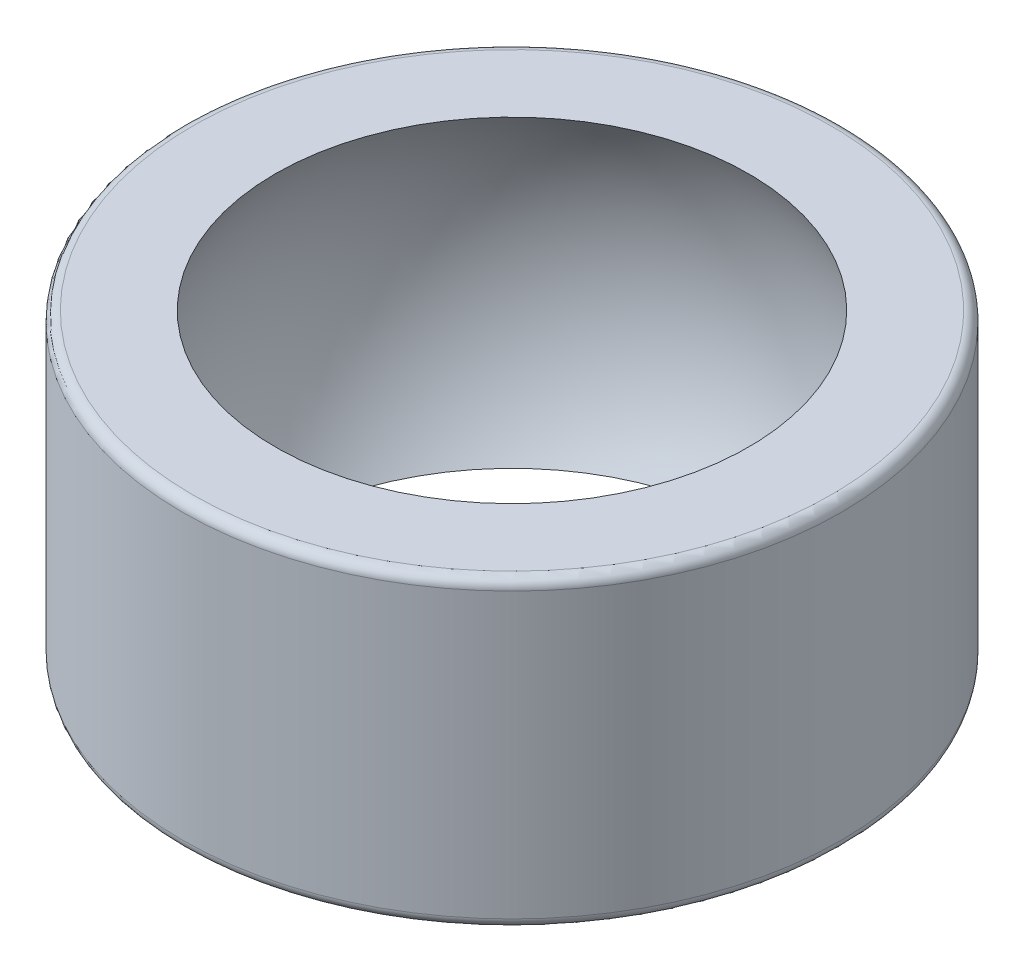
ISO-10303-21;
HEADER;
FILE_DESCRIPTION(('STEP AP214'),'2;1');
FILE_NAME('part.step','',(''),(''),'','','');
FILE_SCHEMA(('AUTOMOTIVE_DESIGN { 1 0 10303 214 1 1 1 1 }'));
ENDSEC;
DATA;
#1=APPLICATION_CONTEXT('core data for automotive mechanical design processes');
#2=APPLICATION_PROTOCOL_DEFINITION('international standard','automotive_design',2000,#1);
#3=PRODUCT_CONTEXT('',#1,'mechanical');
#4=PRODUCT('Part','Part','',(#3));
#5=PRODUCT_RELATED_PRODUCT_CATEGORY('part','',(#4));
#6=PRODUCT_DEFINITION_FORMATION('','',#4);
#7=PRODUCT_DEFINITION_CONTEXT('part definition',#1,'design');
#8=PRODUCT_DEFINITION('design','',#6,#7);
#9=PRODUCT_DEFINITION_SHAPE('','',#8);
#10=(LENGTH_UNIT() NAMED_UNIT(*) SI_UNIT(.MILLI.,.METRE.));
#11=(NAMED_UNIT(*) PLANE_ANGLE_UNIT() SI_UNIT($,.RADIAN.));
#12=(NAMED_UNIT(*) SI_UNIT($,.STERADIAN.) SOLID_ANGLE_UNIT());
#13=UNCERTAINTY_MEASURE_WITH_UNIT(LENGTH_MEASURE(1.E-05),#10,'distance_accuracy_value','');
#14=(GEOMETRIC_REPRESENTATION_CONTEXT(3) GLOBAL_UNCERTAINTY_ASSIGNED_CONTEXT((#13)) GLOBAL_UNIT_ASSIGNED_CONTEXT((#10,
#11,#12)) REPRESENTATION_CONTEXT('',''));
#15=CARTESIAN_POINT('',(0.,0.,0.));
#16=DIRECTION('',(0.,0.,1.));
#17=DIRECTION('',(1.,0.,0.));
#18=AXIS2_PLACEMENT_3D('',#15,#16,#17);
#19=CARTESIAN_POINT('',(0.,3.,0.));
#20=DIRECTION('',(0.,-1.,0.));
#21=DIRECTION('',(0.,0.,-1.));
#22=AXIS2_PLACEMENT_3D('',#19,#20,#21);
#23=CYLINDRICAL_SURFACE('',#22,6.5);
#24=CARTESIAN_POINT('',(0.,-2.8,0.));
#25=DIRECTION('',(0.,1.,0.));
#26=DIRECTION('',(0.,0.,1.));
#27=AXIS2_PLACEMENT_3D('',#24,#25,#26);
#28=CIRCLE('',#27,6.5);
#29=CARTESIAN_POINT('',(0.,-2.8,6.5));
#30=VERTEX_POINT('',#29);
#31=EDGE_CURVE('E42',#30,#30,#28,.T.);
#32=ORIENTED_EDGE('',*,*,#31,.T.);
#33=EDGE_LOOP('',(#32));
#34=FACE_BOUND('',#33,.T.);
#35=CARTESIAN_POINT('',(0.,2.8,0.));
#36=DIRECTION('',(0.,1.,0.));
#37=DIRECTION('',(0.,0.,1.));
#38=AXIS2_PLACEMENT_3D('',#35,#36,#37);
#39=CIRCLE('',#38,6.5);
#40=CARTESIAN_POINT('',(0.,2.8,6.5));
#41=VERTEX_POINT('',#40);
#42=EDGE_CURVE('E46',#41,#41,#39,.F.);
#43=ORIENTED_EDGE('',*,*,#42,.T.);
#44=EDGE_LOOP('',(#43));
#45=FACE_BOUND('',#44,.T.);
#46=ADVANCED_FACE('F31',(#34,#45),#23,.T.);
#47=CARTESIAN_POINT('',(0.,3.,0.));
#48=DIRECTION('',(0.,1.,0.));
#49=DIRECTION('',(0.,0.,1.));
#50=AXIS2_PLACEMENT_3D('',#47,#48,#49);
#51=PLANE('',#50);
#52=CARTESIAN_POINT('',(0.,3.,0.));
#53=DIRECTION('',(0.,1.,0.));
#54=DIRECTION('',(0.,0.,1.));
#55=AXIS2_PLACEMENT_3D('',#52,#53,#54);
#56=CIRCLE('',#55,6.3);
#57=CARTESIAN_POINT('',(0.,3.,6.3));
#58=VERTEX_POINT('',#57);
#59=EDGE_CURVE('E10',#58,#58,#56,.T.);
#60=ORIENTED_EDGE('',*,*,#59,.T.);
#61=EDGE_LOOP('',(#60));
#62=FACE_BOUND('',#61,.T.);
#63=CARTESIAN_POINT('',(0.,3.,0.));
#64=DIRECTION('',(0.,1.,0.));
#65=DIRECTION('',(0.,0.,1.));
#66=AXIS2_PLACEMENT_3D('',#63,#64,#65);
#67=CIRCLE('',#66,4.66931472488202);
#68=CARTESIAN_POINT('',(-4.66931472488202,3.,0.));
#69=VERTEX_POINT('',#68);
#70=EDGE_CURVE('E51',#69,#69,#67,.T.);
#71=ORIENTED_EDGE('',*,*,#70,.F.);
#72=EDGE_LOOP('',(#71));
#73=FACE_BOUND('',#72,.T.);
#74=ADVANCED_FACE('F61',(#62,#73),#51,.T.);
#75=CARTESIAN_POINT('',(0.,-3.,0.));
#76=DIRECTION('',(0.,1.,0.));
#77=DIRECTION('',(0.,0.,1.));
#78=AXIS2_PLACEMENT_3D('',#75,#76,#77);
#79=PLANE('',#78);
#80=CARTESIAN_POINT('',(0.,-3.,0.));
#81=DIRECTION('',(0.,1.,0.));
#82=DIRECTION('',(0.,0.,1.));
#83=AXIS2_PLACEMENT_3D('',#80,#81,#82);
#84=CIRCLE('',#83,6.3);
#85=CARTESIAN_POINT('',(0.,-3.,6.3));
#86=VERTEX_POINT('',#85);
#87=EDGE_CURVE('E38',#86,#86,#84,.F.);
#88=ORIENTED_EDGE('',*,*,#87,.T.);
#89=EDGE_LOOP('',(#88));
#90=FACE_BOUND('',#89,.T.);
#91=CARTESIAN_POINT('',(0.,-3.,0.));
#92=DIRECTION('',(0.,1.,0.));
#93=DIRECTION('',(0.,0.,1.));
#94=AXIS2_PLACEMENT_3D('',#91,#92,#93);
#95=CIRCLE('',#94,4.66931472488202);
#96=CARTESIAN_POINT('',(-4.66931472488201,-3.,0.));
#97=VERTEX_POINT('',#96);
#98=EDGE_CURVE('E52',#97,#97,#95,.T.);
#99=ORIENTED_EDGE('',*,*,#98,.T.);
#100=EDGE_LOOP('',(#99));
#101=FACE_BOUND('',#100,.T.);
#102=ADVANCED_FACE('F63',(#90,#101),#79,.F.);
#103=CARTESIAN_POINT('',(0.,0.,0.));
#104=DIRECTION('',(0.,-1.,0.));
#105=DIRECTION('',(-1.,0.,0.));
#106=AXIS2_PLACEMENT_3D('',#103,#104,#105);
#107=SPHERICAL_SURFACE('',#106,5.55);
#108=CARTESIAN_POINT('',(-4.66931472488202,3.,0.));
#109=CARTESIAN_POINT('',(-4.70500765508084,2.9444471552155,0.));
#110=CARTESIAN_POINT('',(-4.73970826295457,2.88825679032053,0.));
#111=CARTESIAN_POINT('',(-4.80708266801969,2.77467380436874,0.));
#112=CARTESIAN_POINT('',(-4.83975646521107,2.71728118331192,0.));
#113=CARTESIAN_POINT('',(-4.90303508287931,2.60136646909548,0.));
#114=CARTESIAN_POINT('',(-4.93363990335616,2.54284437593587,0.));
#115=CARTESIAN_POINT('',(-4.99274172884819,2.42474535066556,0.));
#116=CARTESIAN_POINT('',(-5.02123873386336,2.36516841855487,0.));
#117=CARTESIAN_POINT('',(-5.07608858929205,2.24503558225238,0.));
#118=CARTESIAN_POINT('',(-5.10244143970556,2.18447967806059,0.));
#119=CARTESIAN_POINT('',(-5.15296942771954,2.06246604095904,0.));
#120=CARTESIAN_POINT('',(-5.17714456532,2.00100830804929,0.));
#121=CARTESIAN_POINT('',(-5.22328633019542,1.87726929774538,0.));
#122=CARTESIAN_POINT('',(-5.24525295747038,1.81498802035123,0.));
#123=CARTESIAN_POINT('',(-5.28694972098628,1.68968125647225,0.));
#124=CARTESIAN_POINT('',(-5.3066798572272,1.62665576998743,0.));
#125=CARTESIAN_POINT('',(-5.34387850589115,1.49994087074025,0.));
#126=CARTESIAN_POINT('',(-5.36134701831418,1.43625145797788,0.));
#127=CARTESIAN_POINT('',(-5.39400016770923,1.30828983486112,0.));
#128=CARTESIAN_POINT('',(-5.40918480468126,1.24401762450673,0.));
#129=CARTESIAN_POINT('',(-5.43725086071189,1.11497227722822,0.));
#130=CARTESIAN_POINT('',(-5.45013227977049,1.05019914030409,0.));
#131=CARTESIAN_POINT('',(-5.47357549140824,0.920234449008035,0.));
#132=CARTESIAN_POINT('',(-5.48413728398738,0.855042894636111,0.));
#133=CARTESIAN_POINT('',(-5.50292778887475,0.724324410550722,0.));
#134=CARTESIAN_POINT('',(-5.51115650118299,0.658797480837259,0.));
#135=CARTESIAN_POINT('',(-5.52527036365565,0.527491715382627,0.));
#136=CARTESIAN_POINT('',(-5.53115551382006,0.461712879641458,0.));
#137=CARTESIAN_POINT('',(-5.54057475540096,0.329987092327209,0.));
#138=CARTESIAN_POINT('',(-5.54410884681744,0.264040140754128,0.));
#139=CARTESIAN_POINT('',(-5.54882146911697,0.132062126120698,0.));
#140=CARTESIAN_POINT('',(-5.55,0.0660310630603486,0.));
#141=CARTESIAN_POINT('',(-5.55,-0.0660310630603499,0.));
#142=CARTESIAN_POINT('',(-5.54882146911697,-0.132062126120699,0.));
#143=CARTESIAN_POINT('',(-5.54410884681744,-0.264040140754129,0.));
#144=CARTESIAN_POINT('',(-5.54057475540096,-0.32998709232721,0.));
#145=CARTESIAN_POINT('',(-5.53115551382006,-0.461712879641459,0.));
#146=CARTESIAN_POINT('',(-5.52527036365565,-0.527491715382628,0.));
#147=CARTESIAN_POINT('',(-5.51115650118299,-0.65879748083726,0.));
#148=CARTESIAN_POINT('',(-5.50292778887475,-0.724324410550724,0.));
#149=CARTESIAN_POINT('',(-5.48413728398738,-0.855042894636112,0.));
#150=CARTESIAN_POINT('',(-5.47357549140824,-0.920234449008037,0.));
#151=CARTESIAN_POINT('',(-5.45013227977049,-1.05019914030409,0.));
#152=CARTESIAN_POINT('',(-5.43725086071189,-1.11497227722822,0.));
#153=CARTESIAN_POINT('',(-5.40918480468126,-1.24401762450674,0.));
#154=CARTESIAN_POINT('',(-5.39400016770923,-1.30828983486113,0.));
#155=CARTESIAN_POINT('',(-5.36134701831418,-1.43625145797788,0.));
#156=CARTESIAN_POINT('',(-5.34387850589115,-1.49994087074025,0.));
#157=CARTESIAN_POINT('',(-5.3066798572272,-1.62665576998744,0.));
#158=CARTESIAN_POINT('',(-5.28694972098628,-1.68968125647225,0.));
#159=CARTESIAN_POINT('',(-5.24525295747038,-1.81498802035123,0.));
#160=CARTESIAN_POINT('',(-5.22328633019542,-1.87726929774538,0.));
#161=CARTESIAN_POINT('',(-5.17714456532,-2.00100830804929,0.));
#162=CARTESIAN_POINT('',(-5.15296942771954,-2.06246604095904,0.));
#163=CARTESIAN_POINT('',(-5.10244143970556,-2.18447967806059,0.));
#164=CARTESIAN_POINT('',(-5.07608858929205,-2.24503558225239,0.));
#165=CARTESIAN_POINT('',(-5.02123873386336,-2.36516841855487,0.));
#166=CARTESIAN_POINT('',(-4.99274172884819,-2.42474535066556,0.));
#167=CARTESIAN_POINT('',(-4.93363990335616,-2.54284437593587,0.));
#168=CARTESIAN_POINT('',(-4.90303508287931,-2.60136646909548,0.));
#169=CARTESIAN_POINT('',(-4.83975646521107,-2.71728118331192,0.));
#170=CARTESIAN_POINT('',(-4.80708266801969,-2.77467380436874,0.));
#171=CARTESIAN_POINT('',(-4.73970826295457,-2.88825679032053,0.));
#172=CARTESIAN_POINT('',(-4.70500765508083,-2.9444471552155,0.));
#173=CARTESIAN_POINT('',(-4.66931472488201,-3.,0.));
#174=B_SPLINE_CURVE_WITH_KNOTS('',3,(#108,#109,#110,#111,#112,#113,#114,#115,#116,#117,#118,
#119,#120,#121,#122,#123,#124,#125,#126,#127,#128,#129,#130,#131,#132,#133,#134,#135,#136,#137,
#138,#139,#140,#141,#142,#143,#144,#145,#146,#147,#148,#149,#150,#151,#152,#153,#154,#155,#156,
#157,#158,#159,#160,#161,#162,#163,#164,#165,#166,#167,#168,#169,#170,#171,#172,#173),
.UNSPECIFIED.,.F.,.F.,(4,2,2,2,2,2,2,2,2,2,2,2,2,2,2,2,2,2,2,2,2,2,2,2,2,2,2,2,2,2,2,2,4),(0.,
0.198082676082593,0.396165352165184,0.594248028247776,0.792330704330368,0.990413380412959,
1.18849605649555,1.38657873257814,1.58466140866073,1.78274408474333,1.98082676082592,
2.17890943690851,2.3769921129911,2.57507478907369,2.77315746515628,2.97124014123888,
3.16932281732147,3.36740549340406,3.56548816948665,3.76357084556924,3.96165352165184,
4.15973619773443,4.35781887381702,4.55590154989961,4.7539842259822,4.95206690206479,
5.15014957814739,5.34823225422998,5.54631493031257,5.74439760639516,5.94248028247775,
6.14056295856035,6.33864563464294),.UNSPECIFIED.);
#175=EDGE_CURVE('BSEAM58',#69,#97,#174,.T.);
#176=ORIENTED_EDGE('',*,*,#70,.T.);
#177=ORIENTED_EDGE('',*,*,#98,.F.);
#178=ORIENTED_EDGE('',*,*,#175,.T.);
#179=ORIENTED_EDGE('',*,*,#175,.F.);
#180=EDGE_LOOP('',(#176,#178,#177,#179));
#181=FACE_BOUND('',#180,.T.);
#182=ADVANCED_FACE('F58',(#181),#107,.F.);
#183=CARTESIAN_POINT('',(0.,-2.8,0.));
#184=DIRECTION('',(0.,1.,0.));
#185=DIRECTION('',(0.,0.,1.));
#186=AXIS2_PLACEMENT_3D('',#183,#184,#185);
#187=TOROIDAL_SURFACE('',#186,6.3,0.2);
#188=ORIENTED_EDGE('',*,*,#87,.F.);
#189=EDGE_LOOP('',(#188));
#190=FACE_BOUND('',#189,.T.);
#191=ORIENTED_EDGE('',*,*,#31,.F.);
#192=EDGE_LOOP('',(#191));
#193=FACE_BOUND('',#192,.T.);
#194=ADVANCED_FACE('F73',(#190,#193),#187,.T.);
#195=CARTESIAN_POINT('',(0.,2.8,0.));
#196=DIRECTION('',(0.,1.,0.));
#197=DIRECTION('',(0.,0.,1.));
#198=AXIS2_PLACEMENT_3D('',#195,#196,#197);
#199=TOROIDAL_SURFACE('',#198,6.3,0.2);
#200=ORIENTED_EDGE('',*,*,#42,.F.);
#201=EDGE_LOOP('',(#200));
#202=FACE_BOUND('',#201,.T.);
#203=ORIENTED_EDGE('',*,*,#59,.F.);
#204=EDGE_LOOP('',(#203));
#205=FACE_BOUND('',#204,.T.);
#206=ADVANCED_FACE('F33',(#202,#205),#199,.T.);
#207=CLOSED_SHELL('',(#46,#74,#102,#182,#194,#206));
#208=MANIFOLD_SOLID_BREP('B2',#207);
#209=ADVANCED_BREP_SHAPE_REPRESENTATION('',(#18,#208),#14);
#210=SHAPE_DEFINITION_REPRESENTATION(#9,#209);
ENDSEC;
END-ISO-10303-21;
